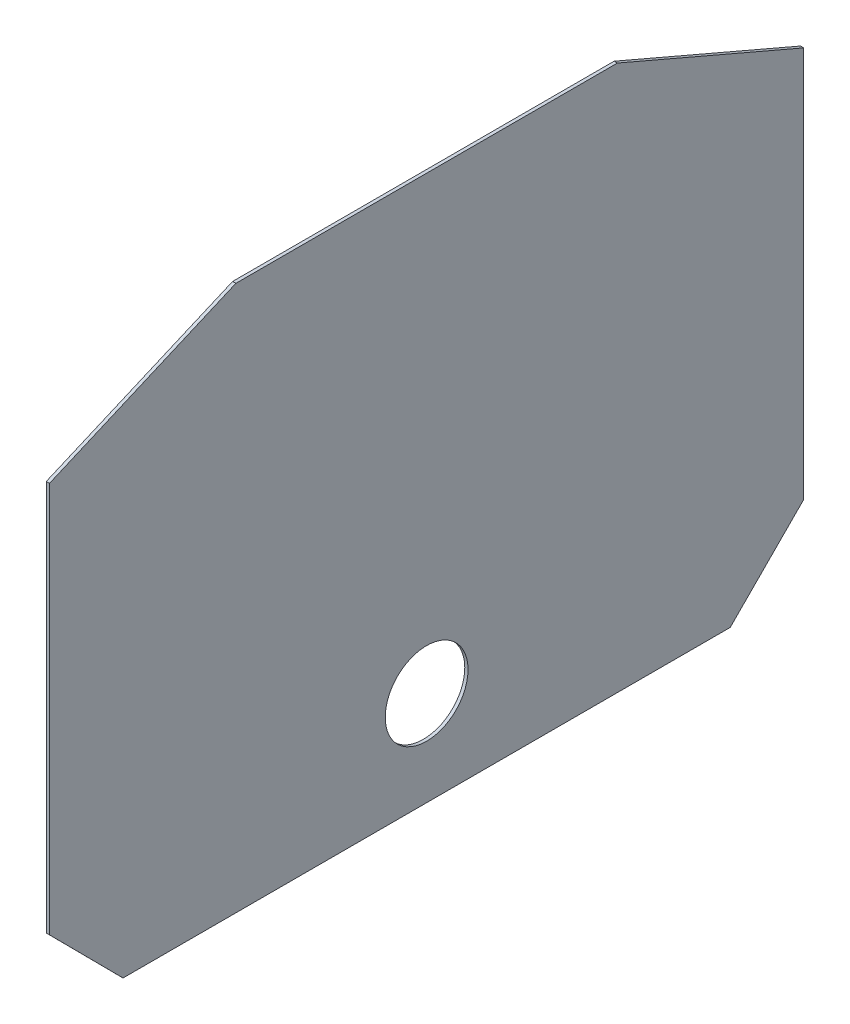
ISO-10303-21;
HEADER;
FILE_DESCRIPTION(('STEP AP214'),'2;1');
FILE_NAME('part.step','',(''),(''),'','','');
FILE_SCHEMA(('AUTOMOTIVE_DESIGN { 1 0 10303 214 1 1 1 1 }'));
ENDSEC;
DATA;
#1=APPLICATION_CONTEXT('core data for automotive mechanical design processes');
#2=APPLICATION_PROTOCOL_DEFINITION('international standard','automotive_design',2000,#1);
#3=PRODUCT_CONTEXT('',#1,'mechanical');
#4=PRODUCT('Part','Part','',(#3));
#5=PRODUCT_RELATED_PRODUCT_CATEGORY('part','',(#4));
#6=PRODUCT_DEFINITION_FORMATION('','',#4);
#7=PRODUCT_DEFINITION_CONTEXT('part definition',#1,'design');
#8=PRODUCT_DEFINITION('design','',#6,#7);
#9=PRODUCT_DEFINITION_SHAPE('','',#8);
#10=(LENGTH_UNIT() NAMED_UNIT(*) SI_UNIT(.MILLI.,.METRE.));
#11=(NAMED_UNIT(*) PLANE_ANGLE_UNIT() SI_UNIT($,.RADIAN.));
#12=(NAMED_UNIT(*) SI_UNIT($,.STERADIAN.) SOLID_ANGLE_UNIT());
#13=UNCERTAINTY_MEASURE_WITH_UNIT(LENGTH_MEASURE(1.E-05),#10,'distance_accuracy_value','');
#14=(GEOMETRIC_REPRESENTATION_CONTEXT(3) GLOBAL_UNCERTAINTY_ASSIGNED_CONTEXT((#13)) GLOBAL_UNIT_ASSIGNED_CONTEXT((#10,
#11,#12)) REPRESENTATION_CONTEXT('',''));
#15=CARTESIAN_POINT('',(0.,0.,0.));
#16=DIRECTION('',(0.,0.,1.));
#17=DIRECTION('',(1.,0.,0.));
#18=AXIS2_PLACEMENT_3D('',#15,#16,#17);
#19=CARTESIAN_POINT('',(-80.3885296032846,0.,0.));
#20=DIRECTION('',(1.,0.,0.));
#21=DIRECTION('',(0.,0.,-1.));
#22=AXIS2_PLACEMENT_3D('',#19,#20,#21);
#23=PLANE('',#22);
#24=DIRECTION('',(0.,-2.56362522451489E-13,1.));
#25=VECTOR('',#24,1.);
#26=CARTESIAN_POINT('',(-80.3885296032846,142.431035531456,90.0115044522124));
#27=LINE('',#26,#25);
#28=CARTESIAN_POINT('',(-80.3885296032846,142.431035531456,90.0115044522124));
#29=VERTEX_POINT('',#28);
#30=CARTESIAN_POINT('',(-80.3885296032846,142.431035531444,136.999339109138));
#31=VERTEX_POINT('',#30);
#32=EDGE_CURVE('E174',#29,#31,#27,.T.);
#33=ORIENTED_EDGE('',*,*,#32,.T.);
#34=DIRECTION('',(0.,-0.394623770896589,0.918842793650446));
#35=VECTOR('',#34,1.);
#36=CARTESIAN_POINT('',(-80.3885296032846,142.431035531444,136.999339109138));
#37=LINE('',#36,#35);
#38=CARTESIAN_POINT('',(-80.3885296032846,132.572551085429,159.953854416098));
#39=VERTEX_POINT('',#38);
#40=EDGE_CURVE('E110',#31,#39,#37,.T.);
#41=ORIENTED_EDGE('',*,*,#40,.T.);
#42=DIRECTION('',(0.,-1.,-1.23317244555778E-13));
#43=VECTOR('',#42,1.);
#44=CARTESIAN_POINT('',(-80.3885296032846,132.572551085429,159.953854416098));
#45=LINE('',#44,#43);
#46=CARTESIAN_POINT('',(-80.3885296032846,84.4065934114558,159.953854416092));
#47=VERTEX_POINT('',#46);
#48=EDGE_CURVE('E195',#39,#47,#45,.T.);
#49=ORIENTED_EDGE('',*,*,#48,.T.);
#50=DIRECTION('',(0.,-0.709795979709922,-0.704407316250784));
#51=VECTOR('',#50,1.);
#52=CARTESIAN_POINT('',(-80.3885296032846,84.4065934114558,159.953854416092));
#53=LINE('',#52,#51);
#54=CARTESIAN_POINT('',(-80.3885296032846,75.2795863244876,150.896138183097));
#55=VERTEX_POINT('',#54);
#56=EDGE_CURVE('E209',#47,#55,#53,.T.);
#57=ORIENTED_EDGE('',*,*,#56,.T.);
#58=DIRECTION('',(0.,2.56097622851844E-13,-1.));
#59=VECTOR('',#58,1.);
#60=CARTESIAN_POINT('',(-80.3885296032846,75.2795863244876,150.896138183097));
#61=LINE('',#60,#59);
#62=CARTESIAN_POINT('',(-80.3885296032846,75.2795863245067,76.1147053782194));
#63=VERTEX_POINT('',#62);
#64=EDGE_CURVE('E129',#55,#63,#61,.T.);
#65=ORIENTED_EDGE('',*,*,#64,.T.);
#66=DIRECTION('',(0.,0.709795979710283,-0.70440731625042));
#67=VECTOR('',#66,1.);
#68=CARTESIAN_POINT('',(-80.3885296032846,75.2795863245067,76.1147053782194));
#69=LINE('',#68,#67);
#70=CARTESIAN_POINT('',(-80.3885296032846,84.4065934114795,67.0569891452291));
#71=VERTEX_POINT('',#70);
#72=EDGE_CURVE('E123',#63,#71,#69,.T.);
#73=ORIENTED_EDGE('',*,*,#72,.T.);
#74=DIRECTION('',(0.,1.,3.89544193082738E-13));
#75=VECTOR('',#74,1.);
#76=CARTESIAN_POINT('',(-80.3885296032846,84.4065934114795,67.0569891452291));
#77=LINE('',#76,#75);
#78=CARTESIAN_POINT('',(-80.3885296032846,132.572551085453,67.0569891452479));
#79=VERTEX_POINT('',#78);
#80=EDGE_CURVE('E127',#71,#79,#77,.T.);
#81=ORIENTED_EDGE('',*,*,#80,.T.);
#82=DIRECTION('',(0.,0.394623770896118,0.918842793650649));
#83=VECTOR('',#82,1.);
#84=CARTESIAN_POINT('',(-80.3885296032846,132.572551085453,67.0569891452479));
#85=LINE('',#84,#83);
#86=EDGE_CURVE('E67',#79,#29,#85,.T.);
#87=ORIENTED_EDGE('',*,*,#86,.T.);
#88=EDGE_LOOP('',(#33,#41,#49,#57,#65,#73,#81,#87));
#89=FACE_BOUND('',#88,.T.);
#90=CARTESIAN_POINT('',(-80.3885296032846,86.9419079817579,113.505740731705));
#91=DIRECTION('',(1.,0.,0.));
#92=DIRECTION('',(0.,0.,-1.));
#93=AXIS2_PLACEMENT_3D('',#90,#91,#92);
#94=CIRCLE('',#93,5.1);
#95=CARTESIAN_POINT('',(-80.3885296032846,86.9419079817579,108.405740731705));
#96=VERTEX_POINT('',#95);
#97=EDGE_CURVE('E156',#96,#96,#94,.T.);
#98=ORIENTED_EDGE('',*,*,#97,.F.);
#99=EDGE_LOOP('',(#98));
#100=FACE_BOUND('',#99,.T.);
#101=ADVANCED_FACE('F49',(#89,#100),#23,.T.);
#102=CARTESIAN_POINT('',(-80.7885296032846,0.,0.));
#103=DIRECTION('',(1.,0.,0.));
#104=DIRECTION('',(0.,0.,-1.));
#105=AXIS2_PLACEMENT_3D('',#102,#103,#104);
#106=PLANE('',#105);
#107=DIRECTION('',(0.,-2.56362522451489E-13,1.));
#108=VECTOR('',#107,1.);
#109=CARTESIAN_POINT('',(-80.7885296032846,142.431035531456,90.0115044522124));
#110=LINE('',#109,#108);
#111=CARTESIAN_POINT('',(-80.7885296032846,142.431035531456,90.0115044522124));
#112=VERTEX_POINT('',#111);
#113=CARTESIAN_POINT('',(-80.7885296032846,142.431035531444,136.999339109138));
#114=VERTEX_POINT('',#113);
#115=EDGE_CURVE('E151',#112,#114,#110,.T.);
#116=ORIENTED_EDGE('',*,*,#115,.F.);
#117=DIRECTION('',(0.,0.394623770896118,0.918842793650649));
#118=VECTOR('',#117,1.);
#119=CARTESIAN_POINT('',(-80.7885296032846,132.572551085453,67.0569891452479));
#120=LINE('',#119,#118);
#121=CARTESIAN_POINT('',(-80.7885296032846,132.572551085453,67.0569891452479));
#122=VERTEX_POINT('',#121);
#123=EDGE_CURVE('E102',#122,#112,#120,.T.);
#124=ORIENTED_EDGE('',*,*,#123,.F.);
#125=DIRECTION('',(0.,1.,3.89544193082738E-13));
#126=VECTOR('',#125,1.);
#127=CARTESIAN_POINT('',(-80.7885296032846,84.4065934114795,67.0569891452291));
#128=LINE('',#127,#126);
#129=CARTESIAN_POINT('',(-80.7885296032846,84.4065934114795,67.0569891452291));
#130=VERTEX_POINT('',#129);
#131=EDGE_CURVE('E96',#130,#122,#128,.T.);
#132=ORIENTED_EDGE('',*,*,#131,.F.);
#133=DIRECTION('',(0.,0.709795979710283,-0.70440731625042));
#134=VECTOR('',#133,1.);
#135=CARTESIAN_POINT('',(-80.7885296032846,75.2795863245067,76.1147053782194));
#136=LINE('',#135,#134);
#137=CARTESIAN_POINT('',(-80.7885296032846,75.2795863245067,76.1147053782194));
#138=VERTEX_POINT('',#137);
#139=EDGE_CURVE('E138',#138,#130,#136,.T.);
#140=ORIENTED_EDGE('',*,*,#139,.F.);
#141=DIRECTION('',(0.,2.56097622851844E-13,-1.));
#142=VECTOR('',#141,1.);
#143=CARTESIAN_POINT('',(-80.7885296032846,75.2795863244876,150.896138183097));
#144=LINE('',#143,#142);
#145=CARTESIAN_POINT('',(-80.7885296032846,75.2795863244876,150.896138183097));
#146=VERTEX_POINT('',#145);
#147=EDGE_CURVE('E165',#146,#138,#144,.T.);
#148=ORIENTED_EDGE('',*,*,#147,.F.);
#149=DIRECTION('',(0.,-0.709795979709922,-0.704407316250784));
#150=VECTOR('',#149,1.);
#151=CARTESIAN_POINT('',(-80.7885296032846,84.4065934114558,159.953854416092));
#152=LINE('',#151,#150);
#153=CARTESIAN_POINT('',(-80.7885296032846,84.4065934114558,159.953854416092));
#154=VERTEX_POINT('',#153);
#155=EDGE_CURVE('E162',#154,#146,#152,.T.);
#156=ORIENTED_EDGE('',*,*,#155,.F.);
#157=DIRECTION('',(0.,-1.,-1.23317244555778E-13));
#158=VECTOR('',#157,1.);
#159=CARTESIAN_POINT('',(-80.7885296032846,132.572551085429,159.953854416098));
#160=LINE('',#159,#158);
#161=CARTESIAN_POINT('',(-80.7885296032846,132.572551085429,159.953854416098));
#162=VERTEX_POINT('',#161);
#163=EDGE_CURVE('E159',#162,#154,#160,.T.);
#164=ORIENTED_EDGE('',*,*,#163,.F.);
#165=DIRECTION('',(0.,-0.394623770896589,0.918842793650446));
#166=VECTOR('',#165,1.);
#167=CARTESIAN_POINT('',(-80.7885296032846,142.431035531444,136.999339109138));
#168=LINE('',#167,#166);
#169=EDGE_CURVE('E155',#114,#162,#168,.T.);
#170=ORIENTED_EDGE('',*,*,#169,.F.);
#171=EDGE_LOOP('',(#116,#124,#132,#140,#148,#156,#164,#170));
#172=FACE_BOUND('',#171,.T.);
#173=CARTESIAN_POINT('',(-80.7885296032846,86.9419079817579,113.505740731705));
#174=DIRECTION('',(1.,0.,0.));
#175=DIRECTION('',(0.,0.,-1.));
#176=AXIS2_PLACEMENT_3D('',#173,#174,#175);
#177=CIRCLE('',#176,5.1);
#178=CARTESIAN_POINT('',(-80.7885296032846,86.9419079817579,108.405740731705));
#179=VERTEX_POINT('',#178);
#180=EDGE_CURVE('E219',#179,#179,#177,.T.);
#181=ORIENTED_EDGE('',*,*,#180,.T.);
#182=EDGE_LOOP('',(#181));
#183=FACE_BOUND('',#182,.T.);
#184=ADVANCED_FACE('F199',(#172,#183),#106,.F.);
#185=CARTESIAN_POINT('',(-80.3885296032846,142.431035531456,90.0115044522124));
#186=DIRECTION('',(0.,-1.,-2.56362522451489E-13));
#187=DIRECTION('',(0.,2.56362522451489E-13,-1.));
#188=AXIS2_PLACEMENT_3D('',#185,#186,#187);
#189=PLANE('',#188);
#190=ORIENTED_EDGE('',*,*,#115,.T.);
#191=DIRECTION('',(-1.,0.,0.));
#192=VECTOR('',#191,1.);
#193=CARTESIAN_POINT('',(-80.3885296032846,142.431035531444,136.999339109138));
#194=LINE('',#193,#192);
#195=EDGE_CURVE('E11',#31,#114,#194,.T.);
#196=ORIENTED_EDGE('',*,*,#195,.F.);
#197=ORIENTED_EDGE('',*,*,#32,.F.);
#198=DIRECTION('',(-1.,0.,0.));
#199=VECTOR('',#198,1.);
#200=CARTESIAN_POINT('',(-80.3885296032846,142.431035531456,90.0115044522124));
#201=LINE('',#200,#199);
#202=EDGE_CURVE('E147',#29,#112,#201,.T.);
#203=ORIENTED_EDGE('',*,*,#202,.T.);
#204=EDGE_LOOP('',(#190,#196,#197,#203));
#205=FACE_BOUND('',#204,.T.);
#206=ADVANCED_FACE('F51',(#205),#189,.F.);
#207=CARTESIAN_POINT('',(-80.3885296032846,142.431035531444,136.999339109138));
#208=DIRECTION('',(0.,-0.918842793650446,-0.394623770896589));
#209=DIRECTION('',(0.,0.394623770896589,-0.918842793650446));
#210=AXIS2_PLACEMENT_3D('',#207,#208,#209);
#211=PLANE('',#210);
#212=ORIENTED_EDGE('',*,*,#169,.T.);
#213=DIRECTION('',(-1.,0.,0.));
#214=VECTOR('',#213,1.);
#215=CARTESIAN_POINT('',(-80.3885296032846,132.572551085429,159.953854416098));
#216=LINE('',#215,#214);
#217=EDGE_CURVE('E59',#39,#162,#216,.T.);
#218=ORIENTED_EDGE('',*,*,#217,.F.);
#219=ORIENTED_EDGE('',*,*,#40,.F.);
#220=ORIENTED_EDGE('',*,*,#195,.T.);
#221=EDGE_LOOP('',(#212,#218,#219,#220));
#222=FACE_BOUND('',#221,.T.);
#223=ADVANCED_FACE('F249',(#222),#211,.F.);
#224=CARTESIAN_POINT('',(-80.3885296032846,132.572551085429,159.953854416098));
#225=DIRECTION('',(0.,1.23317244555778E-13,-1.));
#226=DIRECTION('',(0.,1.,1.23317244555778E-13));
#227=AXIS2_PLACEMENT_3D('',#224,#225,#226);
#228=PLANE('',#227);
#229=ORIENTED_EDGE('',*,*,#163,.T.);
#230=DIRECTION('',(-1.,0.,0.));
#231=VECTOR('',#230,1.);
#232=CARTESIAN_POINT('',(-80.3885296032846,84.4065934114558,159.953854416092));
#233=LINE('',#232,#231);
#234=EDGE_CURVE('E185',#47,#154,#233,.T.);
#235=ORIENTED_EDGE('',*,*,#234,.F.);
#236=ORIENTED_EDGE('',*,*,#48,.F.);
#237=ORIENTED_EDGE('',*,*,#217,.T.);
#238=EDGE_LOOP('',(#229,#235,#236,#237));
#239=FACE_BOUND('',#238,.T.);
#240=ADVANCED_FACE('F193',(#239),#228,.F.);
#241=CARTESIAN_POINT('',(-80.3885296032846,84.4065934114558,159.953854416092));
#242=DIRECTION('',(0.,0.704407316250784,-0.709795979709922));
#243=DIRECTION('',(0.,0.709795979709922,0.704407316250784));
#244=AXIS2_PLACEMENT_3D('',#241,#242,#243);
#245=PLANE('',#244);
#246=ORIENTED_EDGE('',*,*,#155,.T.);
#247=DIRECTION('',(-1.,0.,0.));
#248=VECTOR('',#247,1.);
#249=CARTESIAN_POINT('',(-80.3885296032846,75.2795863244876,150.896138183097));
#250=LINE('',#249,#248);
#251=EDGE_CURVE('E181',#55,#146,#250,.T.);
#252=ORIENTED_EDGE('',*,*,#251,.F.);
#253=ORIENTED_EDGE('',*,*,#56,.F.);
#254=ORIENTED_EDGE('',*,*,#234,.T.);
#255=EDGE_LOOP('',(#246,#252,#253,#254));
#256=FACE_BOUND('',#255,.T.);
#257=ADVANCED_FACE('F204',(#256),#245,.F.);
#258=CARTESIAN_POINT('',(-80.3885296032846,75.2795863244876,150.896138183097));
#259=DIRECTION('',(0.,1.,2.56097622851844E-13));
#260=DIRECTION('',(0.,-2.56097622851844E-13,1.));
#261=AXIS2_PLACEMENT_3D('',#258,#259,#260);
#262=PLANE('',#261);
#263=ORIENTED_EDGE('',*,*,#147,.T.);
#264=DIRECTION('',(-1.,0.,0.));
#265=VECTOR('',#264,1.);
#266=CARTESIAN_POINT('',(-80.3885296032846,75.2795863245067,76.1147053782194));
#267=LINE('',#266,#265);
#268=EDGE_CURVE('E140',#63,#138,#267,.T.);
#269=ORIENTED_EDGE('',*,*,#268,.F.);
#270=ORIENTED_EDGE('',*,*,#64,.F.);
#271=ORIENTED_EDGE('',*,*,#251,.T.);
#272=EDGE_LOOP('',(#263,#269,#270,#271));
#273=FACE_BOUND('',#272,.T.);
#274=ADVANCED_FACE('F207',(#273),#262,.F.);
#275=CARTESIAN_POINT('',(-80.3885296032846,75.2795863245067,76.1147053782194));
#276=DIRECTION('',(0.,0.70440731625042,0.709795979710283));
#277=DIRECTION('',(0.,-0.709795979710283,0.70440731625042));
#278=AXIS2_PLACEMENT_3D('',#275,#276,#277);
#279=PLANE('',#278);
#280=ORIENTED_EDGE('',*,*,#139,.T.);
#281=DIRECTION('',(-1.,0.,0.));
#282=VECTOR('',#281,1.);
#283=CARTESIAN_POINT('',(-80.3885296032846,84.4065934114795,67.0569891452291));
#284=LINE('',#283,#282);
#285=EDGE_CURVE('E135',#71,#130,#284,.T.);
#286=ORIENTED_EDGE('',*,*,#285,.F.);
#287=ORIENTED_EDGE('',*,*,#72,.F.);
#288=ORIENTED_EDGE('',*,*,#268,.T.);
#289=EDGE_LOOP('',(#280,#286,#287,#288));
#290=FACE_BOUND('',#289,.T.);
#291=ADVANCED_FACE('F136',(#290),#279,.F.);
#292=CARTESIAN_POINT('',(-80.3885296032846,84.4065934114795,67.0569891452291));
#293=DIRECTION('',(0.,-3.89544193082738E-13,1.));
#294=DIRECTION('',(0.,-1.,-3.89544193082738E-13));
#295=AXIS2_PLACEMENT_3D('',#292,#293,#294);
#296=PLANE('',#295);
#297=ORIENTED_EDGE('',*,*,#131,.T.);
#298=DIRECTION('',(-1.,0.,0.));
#299=VECTOR('',#298,1.);
#300=CARTESIAN_POINT('',(-80.3885296032846,132.572551085453,67.0569891452479));
#301=LINE('',#300,#299);
#302=EDGE_CURVE('E141',#79,#122,#301,.T.);
#303=ORIENTED_EDGE('',*,*,#302,.F.);
#304=ORIENTED_EDGE('',*,*,#80,.F.);
#305=ORIENTED_EDGE('',*,*,#285,.T.);
#306=EDGE_LOOP('',(#297,#303,#304,#305));
#307=FACE_BOUND('',#306,.T.);
#308=ADVANCED_FACE('F143',(#307),#296,.F.);
#309=CARTESIAN_POINT('',(-80.3885296032846,132.572551085453,67.0569891452479));
#310=DIRECTION('',(0.,-0.918842793650648,0.394623770896118));
#311=DIRECTION('',(0.,-0.394623770896118,-0.918842793650649));
#312=AXIS2_PLACEMENT_3D('',#309,#310,#311);
#313=PLANE('',#312);
#314=ORIENTED_EDGE('',*,*,#123,.T.);
#315=ORIENTED_EDGE('',*,*,#202,.F.);
#316=ORIENTED_EDGE('',*,*,#86,.F.);
#317=ORIENTED_EDGE('',*,*,#302,.T.);
#318=EDGE_LOOP('',(#314,#315,#316,#317));
#319=FACE_BOUND('',#318,.T.);
#320=ADVANCED_FACE('F237',(#319),#313,.F.);
#321=CARTESIAN_POINT('',(-80.3885296032846,86.9419079817579,113.505740731705));
#322=DIRECTION('',(-1.,0.,0.));
#323=DIRECTION('',(0.,0.,1.));
#324=AXIS2_PLACEMENT_3D('',#321,#322,#323);
#325=CYLINDRICAL_SURFACE('',#324,5.1);
#326=ORIENTED_EDGE('',*,*,#97,.T.);
#327=EDGE_LOOP('',(#326));
#328=FACE_BOUND('',#327,.T.);
#329=ORIENTED_EDGE('',*,*,#180,.F.);
#330=EDGE_LOOP('',(#329));
#331=FACE_BOUND('',#330,.T.);
#332=ADVANCED_FACE('F227',(#328,#331),#325,.F.);
#333=CLOSED_SHELL('',(#101,#184,#206,#223,#240,#257,#274,#291,#308,#320,#332));
#334=MANIFOLD_SOLID_BREP('B2',#333);
#335=ADVANCED_BREP_SHAPE_REPRESENTATION('',(#18,#334),#14);
#336=SHAPE_DEFINITION_REPRESENTATION(#9,#335);
ENDSEC;
END-ISO-10303-21;
